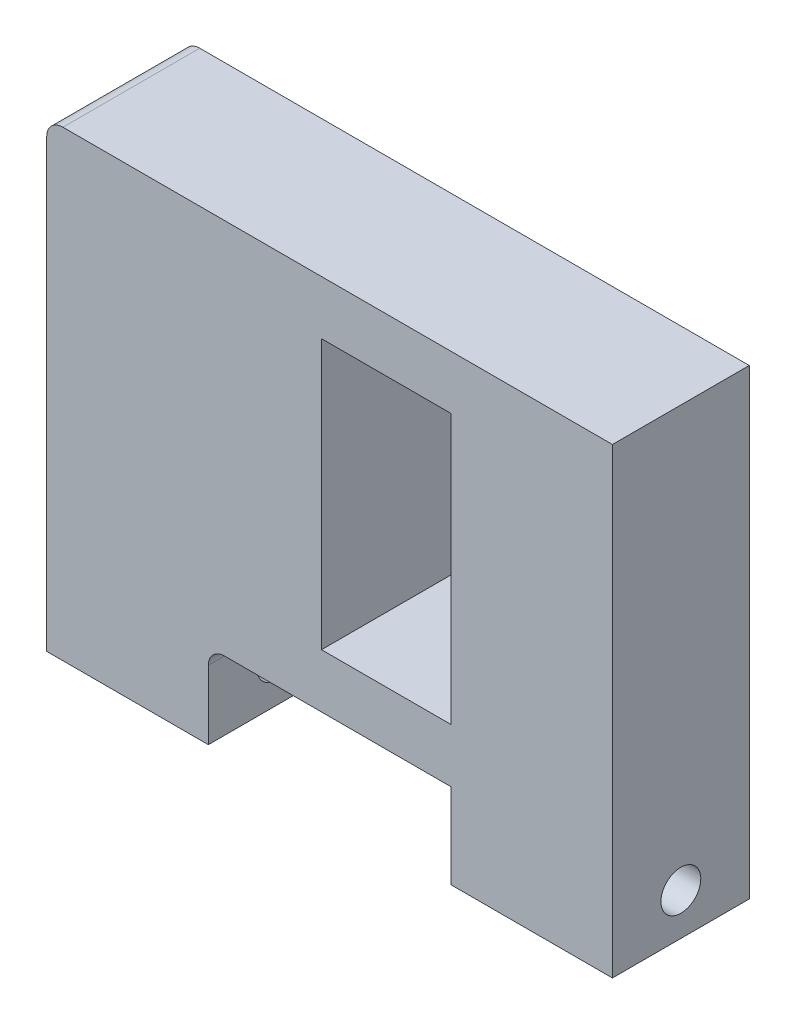
ISO-10303-21;
HEADER;
FILE_DESCRIPTION(('STEP AP214'),'2;1');
FILE_NAME('part.step','',(''),(''),'','','');
FILE_SCHEMA(('AUTOMOTIVE_DESIGN { 1 0 10303 214 1 1 1 1 }'));
ENDSEC;
DATA;
#1=APPLICATION_CONTEXT('core data for automotive mechanical design processes');
#2=APPLICATION_PROTOCOL_DEFINITION('international standard','automotive_design',2000,#1);
#3=PRODUCT_CONTEXT('',#1,'mechanical');
#4=PRODUCT('Part','Part','',(#3));
#5=PRODUCT_RELATED_PRODUCT_CATEGORY('part','',(#4));
#6=PRODUCT_DEFINITION_FORMATION('','',#4);
#7=PRODUCT_DEFINITION_CONTEXT('part definition',#1,'design');
#8=PRODUCT_DEFINITION('design','',#6,#7);
#9=PRODUCT_DEFINITION_SHAPE('','',#8);
#10=(LENGTH_UNIT() NAMED_UNIT(*) SI_UNIT(.MILLI.,.METRE.));
#11=(NAMED_UNIT(*) PLANE_ANGLE_UNIT() SI_UNIT($,.RADIAN.));
#12=(NAMED_UNIT(*) SI_UNIT($,.STERADIAN.) SOLID_ANGLE_UNIT());
#13=UNCERTAINTY_MEASURE_WITH_UNIT(LENGTH_MEASURE(1.E-05),#10,'distance_accuracy_value','');
#14=(GEOMETRIC_REPRESENTATION_CONTEXT(3) GLOBAL_UNCERTAINTY_ASSIGNED_CONTEXT((#13)) GLOBAL_UNIT_ASSIGNED_CONTEXT((#10,
#11,#12)) REPRESENTATION_CONTEXT('',''));
#15=CARTESIAN_POINT('',(0.,0.,0.));
#16=DIRECTION('',(0.,0.,1.));
#17=DIRECTION('',(1.,0.,0.));
#18=AXIS2_PLACEMENT_3D('',#15,#16,#17);
#19=CARTESIAN_POINT('',(-11.25,-3.56,12.7));
#20=DIRECTION('',(-1.,0.,0.));
#21=DIRECTION('',(0.,-1.,0.));
#22=AXIS2_PLACEMENT_3D('',#19,#20,#21);
#23=PLANE('',#22);
#24=CARTESIAN_POINT('',(-11.25,-7.55999999999999,6.35));
#25=DIRECTION('',(-1.,0.,0.));
#26=DIRECTION('',(0.,-1.,0.));
#27=AXIS2_PLACEMENT_3D('',#24,#25,#26);
#28=CIRCLE('',#27,1.85);
#29=CARTESIAN_POINT('',(-11.25,-9.40999999999999,6.35));
#30=VERTEX_POINT('',#29);
#31=EDGE_CURVE('E173',#30,#30,#28,.T.);
#32=ORIENTED_EDGE('',*,*,#31,.T.);
#33=EDGE_LOOP('',(#32));
#34=FACE_BOUND('',#33,.T.);
#35=DIRECTION('',(0.,1.,0.));
#36=VECTOR('',#35,1.);
#37=CARTESIAN_POINT('',(-11.25,-3.56,0.));
#38=LINE('',#37,#36);
#39=CARTESIAN_POINT('',(-11.25,-11.44,0.));
#40=VERTEX_POINT('',#39);
#41=CARTESIAN_POINT('',(-11.25,-5.06,0.));
#42=VERTEX_POINT('',#41);
#43=EDGE_CURVE('E176',#40,#42,#38,.T.);
#44=ORIENTED_EDGE('',*,*,#43,.T.);
#45=DIRECTION('',(0.,0.,-1.));
#46=VECTOR('',#45,1.);
#47=CARTESIAN_POINT('',(-11.25,-5.06,12.7));
#48=LINE('',#47,#46);
#49=CARTESIAN_POINT('',(-11.25,-5.06,12.7));
#50=VERTEX_POINT('',#49);
#51=EDGE_CURVE('E242',#42,#50,#48,.F.);
#52=ORIENTED_EDGE('',*,*,#51,.T.);
#53=DIRECTION('',(0.,1.,0.));
#54=VECTOR('',#53,1.);
#55=CARTESIAN_POINT('',(-11.25,-3.56,12.7));
#56=LINE('',#55,#54);
#57=CARTESIAN_POINT('',(-11.25,-11.44,12.7));
#58=VERTEX_POINT('',#57);
#59=EDGE_CURVE('E177',#58,#50,#56,.T.);
#60=ORIENTED_EDGE('',*,*,#59,.F.);
#61=DIRECTION('',(0.,0.,-1.));
#62=VECTOR('',#61,1.);
#63=CARTESIAN_POINT('',(-11.25,-11.44,12.7));
#64=LINE('',#63,#62);
#65=EDGE_CURVE('E196',#58,#40,#64,.T.);
#66=ORIENTED_EDGE('',*,*,#65,.T.);
#67=EDGE_LOOP('',(#44,#52,#60,#66));
#68=FACE_BOUND('',#67,.T.);
#69=ADVANCED_FACE('F33',(#34,#68),#23,.F.);
#70=CARTESIAN_POINT('',(-11.25,-3.56,12.7));
#71=DIRECTION('',(0.,1.,0.));
#72=DIRECTION('',(0.,0.,1.));
#73=AXIS2_PLACEMENT_3D('',#70,#71,#72);
#74=PLANE('',#73);
#75=DIRECTION('',(1.,0.,0.));
#76=VECTOR('',#75,1.);
#77=CARTESIAN_POINT('',(-11.25,-3.56,12.7));
#78=LINE('',#77,#76);
#79=CARTESIAN_POINT('',(-9.75,-3.56,12.7));
#80=VERTEX_POINT('',#79);
#81=CARTESIAN_POINT('',(11.25,-3.56,12.7));
#82=VERTEX_POINT('',#81);
#83=EDGE_CURVE('E180',#80,#82,#78,.T.);
#84=ORIENTED_EDGE('',*,*,#83,.F.);
#85=DIRECTION('',(0.,0.,-1.));
#86=VECTOR('',#85,1.);
#87=CARTESIAN_POINT('',(-9.75,-3.56,0.));
#88=LINE('',#87,#86);
#89=CARTESIAN_POINT('',(-9.75,-3.56,0.));
#90=VERTEX_POINT('',#89);
#91=EDGE_CURVE('E239',#80,#90,#88,.T.);
#92=ORIENTED_EDGE('',*,*,#91,.T.);
#93=DIRECTION('',(1.,0.,0.));
#94=VECTOR('',#93,1.);
#95=CARTESIAN_POINT('',(-11.25,-3.56,0.));
#96=LINE('',#95,#94);
#97=CARTESIAN_POINT('',(11.25,-3.56,0.));
#98=VERTEX_POINT('',#97);
#99=EDGE_CURVE('E199',#90,#98,#96,.T.);
#100=ORIENTED_EDGE('',*,*,#99,.T.);
#101=DIRECTION('',(0.,0.,-1.));
#102=VECTOR('',#101,1.);
#103=CARTESIAN_POINT('',(11.25,-3.56,12.7));
#104=LINE('',#103,#102);
#105=EDGE_CURVE('E227',#82,#98,#104,.T.);
#106=ORIENTED_EDGE('',*,*,#105,.F.);
#107=EDGE_LOOP('',(#84,#92,#100,#106));
#108=FACE_BOUND('',#107,.T.);
#109=ADVANCED_FACE('F260',(#108),#74,.F.);
#110=CARTESIAN_POINT('',(11.25,-3.56,12.7));
#111=DIRECTION('',(1.,0.,0.));
#112=DIRECTION('',(0.,1.,0.));
#113=AXIS2_PLACEMENT_3D('',#110,#111,#112);
#114=PLANE('',#113);
#115=CARTESIAN_POINT('',(11.25,-7.55999999999999,6.35));
#116=DIRECTION('',(1.,0.,0.));
#117=DIRECTION('',(0.,1.,0.));
#118=AXIS2_PLACEMENT_3D('',#115,#116,#117);
#119=CIRCLE('',#118,1.85);
#120=CARTESIAN_POINT('',(11.25,-5.70999999999999,6.35));
#121=VERTEX_POINT('',#120);
#122=EDGE_CURVE('E168',#121,#121,#119,.T.);
#123=ORIENTED_EDGE('',*,*,#122,.T.);
#124=EDGE_LOOP('',(#123));
#125=FACE_BOUND('',#124,.T.);
#126=DIRECTION('',(0.,-1.,0.));
#127=VECTOR('',#126,1.);
#128=CARTESIAN_POINT('',(11.25,-3.56,0.));
#129=LINE('',#128,#127);
#130=CARTESIAN_POINT('',(11.25,-11.44,0.));
#131=VERTEX_POINT('',#130);
#132=EDGE_CURVE('E201',#98,#131,#129,.T.);
#133=ORIENTED_EDGE('',*,*,#132,.T.);
#134=DIRECTION('',(0.,0.,-1.));
#135=VECTOR('',#134,1.);
#136=CARTESIAN_POINT('',(11.25,-11.44,12.7));
#137=LINE('',#136,#135);
#138=CARTESIAN_POINT('',(11.25,-11.44,12.7));
#139=VERTEX_POINT('',#138);
#140=EDGE_CURVE('E224',#139,#131,#137,.T.);
#141=ORIENTED_EDGE('',*,*,#140,.F.);
#142=DIRECTION('',(0.,-1.,0.));
#143=VECTOR('',#142,1.);
#144=CARTESIAN_POINT('',(11.25,-3.56,12.7));
#145=LINE('',#144,#143);
#146=EDGE_CURVE('E183',#82,#139,#145,.T.);
#147=ORIENTED_EDGE('',*,*,#146,.F.);
#148=ORIENTED_EDGE('',*,*,#105,.T.);
#149=EDGE_LOOP('',(#133,#141,#147,#148));
#150=FACE_BOUND('',#149,.T.);
#151=ADVANCED_FACE('F264',(#125,#150),#114,.F.);
#152=CARTESIAN_POINT('',(11.25,-11.44,12.7));
#153=DIRECTION('',(0.,1.,0.));
#154=DIRECTION('',(-1.,0.,0.));
#155=AXIS2_PLACEMENT_3D('',#152,#153,#154);
#156=PLANE('',#155);
#157=DIRECTION('',(1.,0.,0.));
#158=VECTOR('',#157,1.);
#159=CARTESIAN_POINT('',(11.25,-11.44,0.));
#160=LINE('',#159,#158);
#161=CARTESIAN_POINT('',(26.25,-11.44,0.));
#162=VERTEX_POINT('',#161);
#163=EDGE_CURVE('E203',#131,#162,#160,.T.);
#164=ORIENTED_EDGE('',*,*,#163,.T.);
#165=DIRECTION('',(0.,0.,-1.));
#166=VECTOR('',#165,1.);
#167=CARTESIAN_POINT('',(26.25,-11.44,12.7));
#168=LINE('',#167,#166);
#169=CARTESIAN_POINT('',(26.25,-11.44,12.7));
#170=VERTEX_POINT('',#169);
#171=EDGE_CURVE('E221',#170,#162,#168,.T.);
#172=ORIENTED_EDGE('',*,*,#171,.F.);
#173=DIRECTION('',(1.,0.,0.));
#174=VECTOR('',#173,1.);
#175=CARTESIAN_POINT('',(11.25,-11.44,12.7));
#176=LINE('',#175,#174);
#177=EDGE_CURVE('E185',#139,#170,#176,.T.);
#178=ORIENTED_EDGE('',*,*,#177,.F.);
#179=ORIENTED_EDGE('',*,*,#140,.T.);
#180=EDGE_LOOP('',(#164,#172,#178,#179));
#181=FACE_BOUND('',#180,.T.);
#182=ADVANCED_FACE('F270',(#181),#156,.F.);
#183=CARTESIAN_POINT('',(26.25,31.44,12.7));
#184=DIRECTION('',(-1.,0.,0.));
#185=DIRECTION('',(0.,-1.,0.));
#186=AXIS2_PLACEMENT_3D('',#183,#184,#185);
#187=PLANE('',#186);
#188=CARTESIAN_POINT('',(26.25,-7.55999999999999,6.35));
#189=DIRECTION('',(-1.,0.,0.));
#190=DIRECTION('',(0.,-1.,0.));
#191=AXIS2_PLACEMENT_3D('',#188,#189,#190);
#192=CIRCLE('',#191,1.85);
#193=CARTESIAN_POINT('',(26.25,-9.40999999999998,6.35));
#194=VERTEX_POINT('',#193);
#195=EDGE_CURVE('E165',#194,#194,#192,.T.);
#196=ORIENTED_EDGE('',*,*,#195,.T.);
#197=EDGE_LOOP('',(#196));
#198=FACE_BOUND('',#197,.T.);
#199=DIRECTION('',(0.,1.,0.));
#200=VECTOR('',#199,1.);
#201=CARTESIAN_POINT('',(26.25,31.44,0.));
#202=LINE('',#201,#200);
#203=CARTESIAN_POINT('',(26.25,31.44,0.));
#204=VERTEX_POINT('',#203);
#205=EDGE_CURVE('E205',#162,#204,#202,.T.);
#206=ORIENTED_EDGE('',*,*,#205,.T.);
#207=DIRECTION('',(0.,0.,-1.));
#208=VECTOR('',#207,1.);
#209=CARTESIAN_POINT('',(26.25,31.44,12.7));
#210=LINE('',#209,#208);
#211=CARTESIAN_POINT('',(26.25,31.44,12.7));
#212=VERTEX_POINT('',#211);
#213=EDGE_CURVE('E218',#212,#204,#210,.T.);
#214=ORIENTED_EDGE('',*,*,#213,.F.);
#215=DIRECTION('',(0.,1.,0.));
#216=VECTOR('',#215,1.);
#217=CARTESIAN_POINT('',(26.25,31.44,12.7));
#218=LINE('',#217,#216);
#219=EDGE_CURVE('E187',#170,#212,#218,.T.);
#220=ORIENTED_EDGE('',*,*,#219,.F.);
#221=ORIENTED_EDGE('',*,*,#171,.T.);
#222=EDGE_LOOP('',(#206,#214,#220,#221));
#223=FACE_BOUND('',#222,.T.);
#224=ADVANCED_FACE('F274',(#198,#223),#187,.F.);
#225=CARTESIAN_POINT('',(-26.25,31.44,12.7));
#226=DIRECTION('',(0.,-1.,0.));
#227=DIRECTION('',(0.,0.,-1.));
#228=AXIS2_PLACEMENT_3D('',#225,#226,#227);
#229=PLANE('',#228);
#230=DIRECTION('',(-1.,0.,0.));
#231=VECTOR('',#230,1.);
#232=CARTESIAN_POINT('',(-26.25,31.44,0.));
#233=LINE('',#232,#231);
#234=CARTESIAN_POINT('',(-24.75,31.44,0.));
#235=VERTEX_POINT('',#234);
#236=EDGE_CURVE('E207',#204,#235,#233,.T.);
#237=ORIENTED_EDGE('',*,*,#236,.T.);
#238=DIRECTION('',(0.,0.,-1.));
#239=VECTOR('',#238,1.);
#240=CARTESIAN_POINT('',(-24.75,31.44,12.7));
#241=LINE('',#240,#239);
#242=CARTESIAN_POINT('',(-24.75,31.44,12.7));
#243=VERTEX_POINT('',#242);
#244=EDGE_CURVE('E235',#235,#243,#241,.F.);
#245=ORIENTED_EDGE('',*,*,#244,.T.);
#246=DIRECTION('',(-1.,0.,0.));
#247=VECTOR('',#246,1.);
#248=CARTESIAN_POINT('',(-26.25,31.44,12.7));
#249=LINE('',#248,#247);
#250=EDGE_CURVE('E189',#212,#243,#249,.T.);
#251=ORIENTED_EDGE('',*,*,#250,.F.);
#252=ORIENTED_EDGE('',*,*,#213,.T.);
#253=EDGE_LOOP('',(#237,#245,#251,#252));
#254=FACE_BOUND('',#253,.T.);
#255=ADVANCED_FACE('F278',(#254),#229,.F.);
#256=CARTESIAN_POINT('',(-26.25,31.44,12.7));
#257=DIRECTION('',(1.,0.,0.));
#258=DIRECTION('',(0.,1.,0.));
#259=AXIS2_PLACEMENT_3D('',#256,#257,#258);
#260=PLANE('',#259);
#261=CARTESIAN_POINT('',(-26.25,-7.55999999999999,6.35));
#262=DIRECTION('',(-1.,0.,0.));
#263=DIRECTION('',(0.,-1.,0.));
#264=AXIS2_PLACEMENT_3D('',#261,#262,#263);
#265=CIRCLE('',#264,1.85);
#266=CARTESIAN_POINT('',(-26.25,-9.40999999999999,6.35));
#267=VERTEX_POINT('',#266);
#268=EDGE_CURVE('E163',#267,#267,#265,.T.);
#269=ORIENTED_EDGE('',*,*,#268,.F.);
#270=EDGE_LOOP('',(#269));
#271=FACE_BOUND('',#270,.T.);
#272=DIRECTION('',(0.,-1.,0.));
#273=VECTOR('',#272,1.);
#274=CARTESIAN_POINT('',(-26.25,31.44,12.7));
#275=LINE('',#274,#273);
#276=CARTESIAN_POINT('',(-26.25,29.94,12.7));
#277=VERTEX_POINT('',#276);
#278=CARTESIAN_POINT('',(-26.25,-11.44,12.7));
#279=VERTEX_POINT('',#278);
#280=EDGE_CURVE('E192',#277,#279,#275,.T.);
#281=ORIENTED_EDGE('',*,*,#280,.F.);
#282=DIRECTION('',(0.,0.,-1.));
#283=VECTOR('',#282,1.);
#284=CARTESIAN_POINT('',(-26.25,29.94,12.7));
#285=LINE('',#284,#283);
#286=CARTESIAN_POINT('',(-26.25,29.94,0.));
#287=VERTEX_POINT('',#286);
#288=EDGE_CURVE('E230',#277,#287,#285,.T.);
#289=ORIENTED_EDGE('',*,*,#288,.T.);
#290=DIRECTION('',(0.,-1.,0.));
#291=VECTOR('',#290,1.);
#292=CARTESIAN_POINT('',(-26.25,31.44,0.));
#293=LINE('',#292,#291);
#294=CARTESIAN_POINT('',(-26.25,-11.44,0.));
#295=VERTEX_POINT('',#294);
#296=EDGE_CURVE('E210',#287,#295,#293,.T.);
#297=ORIENTED_EDGE('',*,*,#296,.T.);
#298=DIRECTION('',(0.,0.,-1.));
#299=VECTOR('',#298,1.);
#300=CARTESIAN_POINT('',(-26.25,-11.44,12.7));
#301=LINE('',#300,#299);
#302=EDGE_CURVE('E215',#279,#295,#301,.T.);
#303=ORIENTED_EDGE('',*,*,#302,.F.);
#304=EDGE_LOOP('',(#281,#289,#297,#303));
#305=FACE_BOUND('',#304,.T.);
#306=ADVANCED_FACE('F286',(#271,#305),#260,.F.);
#307=CARTESIAN_POINT('',(-26.25,-11.44,12.7));
#308=DIRECTION('',(0.,1.,0.));
#309=DIRECTION('',(0.,0.,1.));
#310=AXIS2_PLACEMENT_3D('',#307,#308,#309);
#311=PLANE('',#310);
#312=DIRECTION('',(1.,0.,0.));
#313=VECTOR('',#312,1.);
#314=CARTESIAN_POINT('',(-26.25,-11.44,0.));
#315=LINE('',#314,#313);
#316=EDGE_CURVE('E181',#295,#40,#315,.T.);
#317=ORIENTED_EDGE('',*,*,#316,.T.);
#318=ORIENTED_EDGE('',*,*,#65,.F.);
#319=DIRECTION('',(1.,0.,0.));
#320=VECTOR('',#319,1.);
#321=CARTESIAN_POINT('',(-26.25,-11.44,12.7));
#322=LINE('',#321,#320);
#323=EDGE_CURVE('E194',#279,#58,#322,.T.);
#324=ORIENTED_EDGE('',*,*,#323,.F.);
#325=ORIENTED_EDGE('',*,*,#302,.T.);
#326=EDGE_LOOP('',(#317,#318,#324,#325));
#327=FACE_BOUND('',#326,.T.);
#328=ADVANCED_FACE('F289',(#327),#311,.F.);
#329=CARTESIAN_POINT('',(0.,0.,12.7));
#330=DIRECTION('',(0.,0.,1.));
#331=DIRECTION('',(1.,0.,0.));
#332=AXIS2_PLACEMENT_3D('',#329,#330,#331);
#333=PLANE('',#332);
#334=DIRECTION('',(0.,-1.,0.));
#335=VECTOR('',#334,1.);
#336=CARTESIAN_POINT('',(-0.74999999999999,26.445,12.7));
#337=LINE('',#336,#335);
#338=CARTESIAN_POINT('',(-0.74999999999999,26.445,12.7));
#339=VERTEX_POINT('',#338);
#340=CARTESIAN_POINT('',(-0.749999999999988,1.445,12.7));
#341=VERTEX_POINT('',#340);
#342=EDGE_CURVE('E48',#339,#341,#337,.T.);
#343=ORIENTED_EDGE('',*,*,#342,.F.);
#344=DIRECTION('',(-1.,0.,0.));
#345=VECTOR('',#344,1.);
#346=CARTESIAN_POINT('',(-0.74999999999999,26.445,12.7));
#347=LINE('',#346,#345);
#348=CARTESIAN_POINT('',(11.25,26.445,12.7));
#349=VERTEX_POINT('',#348);
#350=EDGE_CURVE('E152',#349,#339,#347,.T.);
#351=ORIENTED_EDGE('',*,*,#350,.F.);
#352=DIRECTION('',(0.,1.,0.));
#353=VECTOR('',#352,1.);
#354=CARTESIAN_POINT('',(11.25,26.445,12.7));
#355=LINE('',#354,#353);
#356=CARTESIAN_POINT('',(11.25,1.445,12.7));
#357=VERTEX_POINT('',#356);
#358=EDGE_CURVE('E136',#357,#349,#355,.T.);
#359=ORIENTED_EDGE('',*,*,#358,.F.);
#360=DIRECTION('',(1.,0.,0.));
#361=VECTOR('',#360,1.);
#362=CARTESIAN_POINT('',(-0.749999999999988,1.445,12.7));
#363=LINE('',#362,#361);
#364=EDGE_CURVE('E145',#341,#357,#363,.T.);
#365=ORIENTED_EDGE('',*,*,#364,.F.);
#366=EDGE_LOOP('',(#343,#351,#359,#365));
#367=FACE_BOUND('',#366,.T.);
#368=ORIENTED_EDGE('',*,*,#250,.T.);
#369=CARTESIAN_POINT('',(-24.75,29.94,12.7));
#370=DIRECTION('',(0.,0.,1.));
#371=DIRECTION('',(1.,0.,0.));
#372=AXIS2_PLACEMENT_3D('',#369,#370,#371);
#373=CIRCLE('',#372,1.5);
#374=EDGE_CURVE('E237',#243,#277,#373,.T.);
#375=ORIENTED_EDGE('',*,*,#374,.T.);
#376=ORIENTED_EDGE('',*,*,#280,.T.);
#377=ORIENTED_EDGE('',*,*,#323,.T.);
#378=ORIENTED_EDGE('',*,*,#59,.T.);
#379=CARTESIAN_POINT('',(-9.75,-5.06,12.7));
#380=DIRECTION('',(0.,0.,1.));
#381=DIRECTION('',(1.,0.,0.));
#382=AXIS2_PLACEMENT_3D('',#379,#380,#381);
#383=CIRCLE('',#382,1.5);
#384=EDGE_CURVE('E11',#50,#80,#383,.F.);
#385=ORIENTED_EDGE('',*,*,#384,.T.);
#386=ORIENTED_EDGE('',*,*,#83,.T.);
#387=ORIENTED_EDGE('',*,*,#146,.T.);
#388=ORIENTED_EDGE('',*,*,#177,.T.);
#389=ORIENTED_EDGE('',*,*,#219,.T.);
#390=EDGE_LOOP('',(#368,#375,#376,#377,#378,#385,#386,#387,#388,#389));
#391=FACE_BOUND('',#390,.T.);
#392=ADVANCED_FACE('F149',(#367,#391),#333,.T.);
#393=CARTESIAN_POINT('',(0.,0.,0.));
#394=DIRECTION('',(0.,0.,1.));
#395=DIRECTION('',(1.,0.,0.));
#396=AXIS2_PLACEMENT_3D('',#393,#394,#395);
#397=PLANE('',#396);
#398=DIRECTION('',(1.,0.,0.));
#399=VECTOR('',#398,1.);
#400=CARTESIAN_POINT('',(-0.74999999999999,26.445,0.));
#401=LINE('',#400,#399);
#402=CARTESIAN_POINT('',(-0.74999999999999,26.445,0.));
#403=VERTEX_POINT('',#402);
#404=CARTESIAN_POINT('',(11.25,26.445,0.));
#405=VERTEX_POINT('',#404);
#406=EDGE_CURVE('E337',#403,#405,#401,.T.);
#407=ORIENTED_EDGE('',*,*,#406,.F.);
#408=DIRECTION('',(0.,1.,0.));
#409=VECTOR('',#408,1.);
#410=CARTESIAN_POINT('',(-0.74999999999999,26.445,0.));
#411=LINE('',#410,#409);
#412=CARTESIAN_POINT('',(-0.749999999999988,1.445,0.));
#413=VERTEX_POINT('',#412);
#414=EDGE_CURVE('E164',#413,#403,#411,.T.);
#415=ORIENTED_EDGE('',*,*,#414,.F.);
#416=DIRECTION('',(-1.,0.,0.));
#417=VECTOR('',#416,1.);
#418=CARTESIAN_POINT('',(-0.749999999999988,1.445,0.));
#419=LINE('',#418,#417);
#420=CARTESIAN_POINT('',(11.25,1.445,0.));
#421=VERTEX_POINT('',#420);
#422=EDGE_CURVE('E161',#421,#413,#419,.T.);
#423=ORIENTED_EDGE('',*,*,#422,.F.);
#424=DIRECTION('',(0.,-1.,0.));
#425=VECTOR('',#424,1.);
#426=CARTESIAN_POINT('',(11.25,26.445,0.));
#427=LINE('',#426,#425);
#428=EDGE_CURVE('E139',#405,#421,#427,.T.);
#429=ORIENTED_EDGE('',*,*,#428,.F.);
#430=EDGE_LOOP('',(#407,#415,#423,#429));
#431=FACE_BOUND('',#430,.T.);
#432=ORIENTED_EDGE('',*,*,#296,.F.);
#433=CARTESIAN_POINT('',(-24.75,29.94,0.));
#434=DIRECTION('',(0.,0.,1.));
#435=DIRECTION('',(1.,0.,0.));
#436=AXIS2_PLACEMENT_3D('',#433,#434,#435);
#437=CIRCLE('',#436,1.5);
#438=EDGE_CURVE('E233',#287,#235,#437,.F.);
#439=ORIENTED_EDGE('',*,*,#438,.T.);
#440=ORIENTED_EDGE('',*,*,#236,.F.);
#441=ORIENTED_EDGE('',*,*,#205,.F.);
#442=ORIENTED_EDGE('',*,*,#163,.F.);
#443=ORIENTED_EDGE('',*,*,#132,.F.);
#444=ORIENTED_EDGE('',*,*,#99,.F.);
#445=CARTESIAN_POINT('',(-9.75,-5.06,0.));
#446=DIRECTION('',(0.,0.,1.));
#447=DIRECTION('',(1.,0.,0.));
#448=AXIS2_PLACEMENT_3D('',#445,#446,#447);
#449=CIRCLE('',#448,1.5);
#450=EDGE_CURVE('E41',#90,#42,#449,.T.);
#451=ORIENTED_EDGE('',*,*,#450,.T.);
#452=ORIENTED_EDGE('',*,*,#43,.F.);
#453=ORIENTED_EDGE('',*,*,#316,.F.);
#454=EDGE_LOOP('',(#432,#439,#440,#441,#442,#443,#444,#451,#452,#453));
#455=FACE_BOUND('',#454,.T.);
#456=ADVANCED_FACE('F247',(#431,#455),#397,.F.);
#457=CARTESIAN_POINT('',(-24.75,29.94,12.7));
#458=DIRECTION('',(0.,0.,-1.));
#459=DIRECTION('',(-1.,0.,0.));
#460=AXIS2_PLACEMENT_3D('',#457,#458,#459);
#461=CYLINDRICAL_SURFACE('',#460,1.5);
#462=ORIENTED_EDGE('',*,*,#374,.F.);
#463=ORIENTED_EDGE('',*,*,#244,.F.);
#464=ORIENTED_EDGE('',*,*,#438,.F.);
#465=ORIENTED_EDGE('',*,*,#288,.F.);
#466=EDGE_LOOP('',(#462,#463,#464,#465));
#467=FACE_BOUND('',#466,.T.);
#468=ADVANCED_FACE('F284',(#467),#461,.T.);
#469=CARTESIAN_POINT('',(-9.75,-5.06,12.7));
#470=DIRECTION('',(0.,0.,1.));
#471=DIRECTION('',(1.,0.,0.));
#472=AXIS2_PLACEMENT_3D('',#469,#470,#471);
#473=CYLINDRICAL_SURFACE('',#472,1.5);
#474=ORIENTED_EDGE('',*,*,#384,.F.);
#475=ORIENTED_EDGE('',*,*,#51,.F.);
#476=ORIENTED_EDGE('',*,*,#450,.F.);
#477=ORIENTED_EDGE('',*,*,#91,.F.);
#478=EDGE_LOOP('',(#474,#475,#476,#477));
#479=FACE_BOUND('',#478,.T.);
#480=ADVANCED_FACE('F35',(#479),#473,.F.);
#481=CARTESIAN_POINT('',(26.25,-7.55999999999999,6.35));
#482=DIRECTION('',(-1.,0.,0.));
#483=DIRECTION('',(0.,-1.,0.));
#484=AXIS2_PLACEMENT_3D('',#481,#482,#483);
#485=CYLINDRICAL_SURFACE('',#484,1.85);
#486=ORIENTED_EDGE('',*,*,#268,.T.);
#487=EDGE_LOOP('',(#486));
#488=FACE_BOUND('',#487,.T.);
#489=ORIENTED_EDGE('',*,*,#31,.F.);
#490=EDGE_LOOP('',(#489));
#491=FACE_BOUND('',#490,.T.);
#492=ADVANCED_FACE('F314',(#488,#491),#485,.F.);
#493=ORIENTED_EDGE('',*,*,#195,.F.);
#494=EDGE_LOOP('',(#493));
#495=FACE_BOUND('',#494,.T.);
#496=ORIENTED_EDGE('',*,*,#122,.F.);
#497=EDGE_LOOP('',(#496));
#498=FACE_BOUND('',#497,.T.);
#499=ADVANCED_FACE('F322',(#495,#498),#485,.F.);
#500=CARTESIAN_POINT('',(-0.74999999999999,26.445,-27.7308492477241));
#501=DIRECTION('',(-1.,0.,0.));
#502=DIRECTION('',(0.,-1.,0.));
#503=AXIS2_PLACEMENT_3D('',#500,#501,#502);
#504=PLANE('',#503);
#505=ORIENTED_EDGE('',*,*,#414,.T.);
#506=DIRECTION('',(0.,0.,1.));
#507=VECTOR('',#506,1.);
#508=CARTESIAN_POINT('',(-0.74999999999999,26.445,-27.7308492477241));
#509=LINE('',#508,#507);
#510=EDGE_CURVE('E157',#403,#339,#509,.T.);
#511=ORIENTED_EDGE('',*,*,#510,.T.);
#512=ORIENTED_EDGE('',*,*,#342,.T.);
#513=DIRECTION('',(0.,0.,1.));
#514=VECTOR('',#513,1.);
#515=CARTESIAN_POINT('',(-0.749999999999988,1.445,-27.7308492477241));
#516=LINE('',#515,#514);
#517=EDGE_CURVE('E142',#413,#341,#516,.T.);
#518=ORIENTED_EDGE('',*,*,#517,.F.);
#519=EDGE_LOOP('',(#505,#511,#512,#518));
#520=FACE_BOUND('',#519,.T.);
#521=ADVANCED_FACE('F324',(#520),#504,.F.);
#522=CARTESIAN_POINT('',(-0.74999999999999,26.445,-27.7308492477241));
#523=DIRECTION('',(0.,1.,0.));
#524=DIRECTION('',(0.,0.,1.));
#525=AXIS2_PLACEMENT_3D('',#522,#523,#524);
#526=PLANE('',#525);
#527=ORIENTED_EDGE('',*,*,#406,.T.);
#528=DIRECTION('',(0.,0.,1.));
#529=VECTOR('',#528,1.);
#530=CARTESIAN_POINT('',(11.25,26.445,-27.7308492477241));
#531=LINE('',#530,#529);
#532=EDGE_CURVE('E141',#405,#349,#531,.T.);
#533=ORIENTED_EDGE('',*,*,#532,.T.);
#534=ORIENTED_EDGE('',*,*,#350,.T.);
#535=ORIENTED_EDGE('',*,*,#510,.F.);
#536=EDGE_LOOP('',(#527,#533,#534,#535));
#537=FACE_BOUND('',#536,.T.);
#538=ADVANCED_FACE('F327',(#537),#526,.F.);
#539=CARTESIAN_POINT('',(11.25,26.445,-27.7308492477241));
#540=DIRECTION('',(1.,0.,0.));
#541=DIRECTION('',(0.,1.,0.));
#542=AXIS2_PLACEMENT_3D('',#539,#540,#541);
#543=PLANE('',#542);
#544=ORIENTED_EDGE('',*,*,#428,.T.);
#545=DIRECTION('',(0.,0.,1.));
#546=VECTOR('',#545,1.);
#547=CARTESIAN_POINT('',(11.25,1.445,-27.7308492477241));
#548=LINE('',#547,#546);
#549=EDGE_CURVE('E56',#421,#357,#548,.T.);
#550=ORIENTED_EDGE('',*,*,#549,.T.);
#551=ORIENTED_EDGE('',*,*,#358,.T.);
#552=ORIENTED_EDGE('',*,*,#532,.F.);
#553=EDGE_LOOP('',(#544,#550,#551,#552));
#554=FACE_BOUND('',#553,.T.);
#555=ADVANCED_FACE('F133',(#554),#543,.F.);
#556=CARTESIAN_POINT('',(-0.749999999999988,1.445,-27.7308492477241));
#557=DIRECTION('',(0.,-1.,0.));
#558=DIRECTION('',(0.,0.,-1.));
#559=AXIS2_PLACEMENT_3D('',#556,#557,#558);
#560=PLANE('',#559);
#561=ORIENTED_EDGE('',*,*,#422,.T.);
#562=ORIENTED_EDGE('',*,*,#517,.T.);
#563=ORIENTED_EDGE('',*,*,#364,.T.);
#564=ORIENTED_EDGE('',*,*,#549,.F.);
#565=EDGE_LOOP('',(#561,#562,#563,#564));
#566=FACE_BOUND('',#565,.T.);
#567=ADVANCED_FACE('F146',(#566),#560,.F.);
#568=CLOSED_SHELL('',(#69,#109,#151,#182,#224,#255,#306,#328,#392,#456,#468,#480,#492,#499,#521,
#538,#555,#567));
#569=MANIFOLD_SOLID_BREP('B2',#568);
#570=ADVANCED_BREP_SHAPE_REPRESENTATION('',(#18,#569),#14);
#571=SHAPE_DEFINITION_REPRESENTATION(#9,#570);
ENDSEC;
END-ISO-10303-21;
